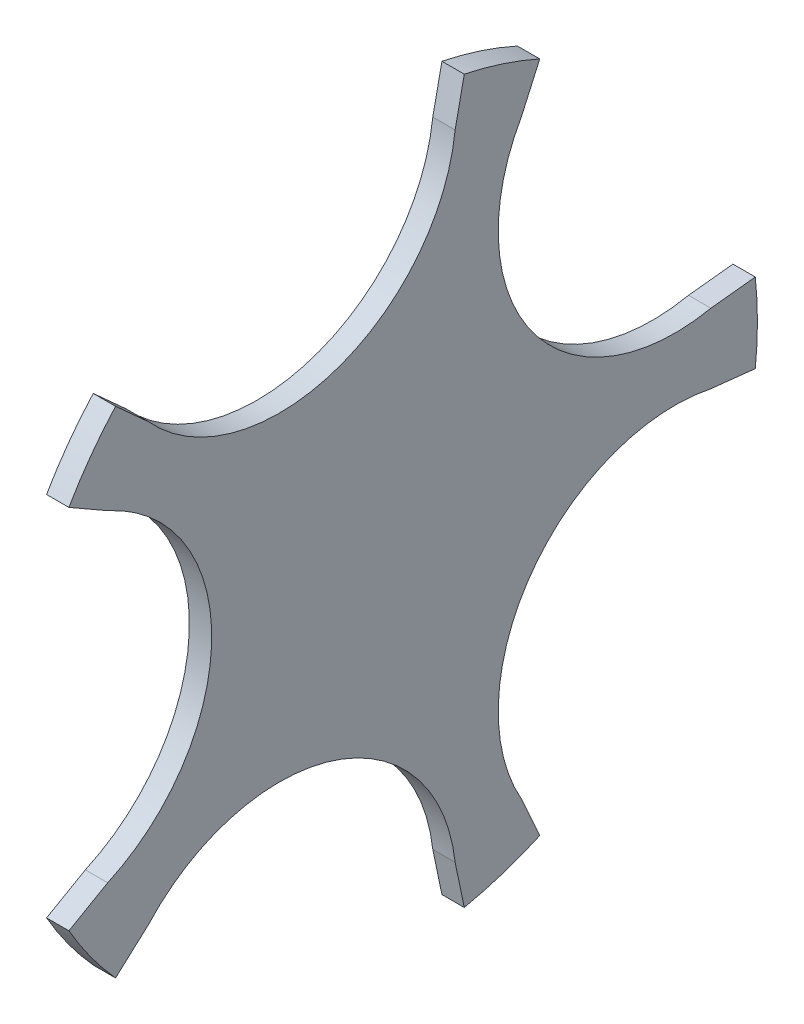
ISO-10303-21;
HEADER;
FILE_DESCRIPTION(('STEP AP214'),'2;1');
FILE_NAME('part.step','',(''),(''),'','','');
FILE_SCHEMA(('AUTOMOTIVE_DESIGN { 1 0 10303 214 1 1 1 1 }'));
ENDSEC;
DATA;
#1=APPLICATION_CONTEXT('core data for automotive mechanical design processes');
#2=APPLICATION_PROTOCOL_DEFINITION('international standard','automotive_design',2000,#1);
#3=PRODUCT_CONTEXT('',#1,'mechanical');
#4=PRODUCT('Part','Part','',(#3));
#5=PRODUCT_RELATED_PRODUCT_CATEGORY('part','',(#4));
#6=PRODUCT_DEFINITION_FORMATION('','',#4);
#7=PRODUCT_DEFINITION_CONTEXT('part definition',#1,'design');
#8=PRODUCT_DEFINITION('design','',#6,#7);
#9=PRODUCT_DEFINITION_SHAPE('','',#8);
#10=(LENGTH_UNIT() NAMED_UNIT(*) SI_UNIT(.MILLI.,.METRE.));
#11=(NAMED_UNIT(*) PLANE_ANGLE_UNIT() SI_UNIT($,.RADIAN.));
#12=(NAMED_UNIT(*) SI_UNIT($,.STERADIAN.) SOLID_ANGLE_UNIT());
#13=UNCERTAINTY_MEASURE_WITH_UNIT(LENGTH_MEASURE(1.E-05),#10,'distance_accuracy_value','');
#14=(GEOMETRIC_REPRESENTATION_CONTEXT(3) GLOBAL_UNCERTAINTY_ASSIGNED_CONTEXT((#13)) GLOBAL_UNIT_ASSIGNED_CONTEXT((#10,
#11,#12)) REPRESENTATION_CONTEXT('',''));
#15=CARTESIAN_POINT('',(0.,0.,0.));
#16=DIRECTION('',(0.,0.,1.));
#17=DIRECTION('',(1.,0.,0.));
#18=AXIS2_PLACEMENT_3D('',#15,#16,#17);
#19=CARTESIAN_POINT('',(7.1923076923077,3.32026073301961E-12,-5.08013769939808E-12));
#20=DIRECTION('',(1.,0.,0.));
#21=DIRECTION('',(0.,0.,-1.));
#22=AXIS2_PLACEMENT_3D('',#19,#20,#21);
#23=CYLINDRICAL_SURFACE('',#22,8.25000000000605);
#24=CARTESIAN_POINT('',(7.6923076923077,3.32026073301961E-12,-5.08013769939808E-12));
#25=DIRECTION('',(1.,0.,0.));
#26=DIRECTION('',(0.,0.,-1.));
#27=AXIS2_PLACEMENT_3D('',#24,#25,#26);
#28=CIRCLE('',#27,8.25000000000605);
#29=CARTESIAN_POINT('',(7.6923076923077,-4.1024089888532,7.1577049735356));
#30=VERTEX_POINT('',#29);
#31=CARTESIAN_POINT('',(7.6923076923077,-5.5396678613671,6.1134752789013));
#32=VERTEX_POINT('',#31);
#33=EDGE_CURVE('E206',#30,#32,#28,.T.);
#34=ORIENTED_EDGE('',*,*,#33,.F.);
#35=DIRECTION('',(1.,0.,0.));
#36=VECTOR('',#35,1.);
#37=CARTESIAN_POINT('',(7.1923076923077,-4.1024089888532,7.1577049735356));
#38=LINE('',#37,#36);
#39=CARTESIAN_POINT('',(7.1923076923077,-4.1024089888532,7.1577049735356));
#40=VERTEX_POINT('',#39);
#41=EDGE_CURVE('E11',#40,#30,#38,.T.);
#42=ORIENTED_EDGE('',*,*,#41,.F.);
#43=CARTESIAN_POINT('',(7.1923076923077,3.32026073301961E-12,-5.08013769939808E-12));
#44=DIRECTION('',(1.,0.,0.));
#45=DIRECTION('',(0.,0.,-1.));
#46=AXIS2_PLACEMENT_3D('',#43,#44,#45);
#47=CIRCLE('',#46,8.25000000000605);
#48=CARTESIAN_POINT('',(7.1923076923077,-5.5396678613671,6.1134752789013));
#49=VERTEX_POINT('',#48);
#50=EDGE_CURVE('E262',#40,#49,#47,.T.);
#51=ORIENTED_EDGE('',*,*,#50,.T.);
#52=DIRECTION('',(1.,0.,0.));
#53=VECTOR('',#52,1.);
#54=CARTESIAN_POINT('',(7.1923076923077,-5.5396678613671,6.1134752789013));
#55=LINE('',#54,#53);
#56=EDGE_CURVE('E40',#49,#32,#55,.T.);
#57=ORIENTED_EDGE('',*,*,#56,.T.);
#58=EDGE_LOOP('',(#34,#42,#51,#57));
#59=FACE_BOUND('',#58,.T.);
#60=ADVANCED_FACE('F37',(#59),#23,.T.);
#61=CARTESIAN_POINT('',(7.1923076923077,-3.6052767652143,6.290330267768));
#62=DIRECTION('',(0.,0.867600602852798,0.497261695618577));
#63=DIRECTION('',(0.,-0.497261695618577,0.867600602852798));
#64=AXIS2_PLACEMENT_3D('',#61,#62,#63);
#65=PLANE('',#64);
#66=DIRECTION('',(0.,-0.497261695618577,0.867600602852797));
#67=VECTOR('',#66,1.);
#68=CARTESIAN_POINT('',(7.6923076923077,-3.6052767652143,6.290330267768));
#69=LINE('',#68,#67);
#70=CARTESIAN_POINT('',(7.6923076923077,-3.6052767652143,6.290330267768));
#71=VERTEX_POINT('',#70);
#72=EDGE_CURVE('E260',#71,#30,#69,.T.);
#73=ORIENTED_EDGE('',*,*,#72,.F.);
#74=DIRECTION('',(1.,0.,0.));
#75=VECTOR('',#74,1.);
#76=CARTESIAN_POINT('',(7.1923076923077,-3.6052767652143,6.290330267768));
#77=LINE('',#76,#75);
#78=CARTESIAN_POINT('',(7.1923076923077,-3.6052767652143,6.290330267768));
#79=VERTEX_POINT('',#78);
#80=EDGE_CURVE('E46',#79,#71,#77,.T.);
#81=ORIENTED_EDGE('',*,*,#80,.F.);
#82=DIRECTION('',(0.,-0.497261695618577,0.867600602852797));
#83=VECTOR('',#82,1.);
#84=CARTESIAN_POINT('',(7.1923076923077,-3.6052767652143,6.290330267768));
#85=LINE('',#84,#83);
#86=EDGE_CURVE('E196',#79,#40,#85,.T.);
#87=ORIENTED_EDGE('',*,*,#86,.T.);
#88=ORIENTED_EDGE('',*,*,#41,.T.);
#89=EDGE_LOOP('',(#73,#81,#87,#88));
#90=FACE_BOUND('',#89,.T.);
#91=ADVANCED_FACE('F298',(#90),#65,.T.);
#92=CARTESIAN_POINT('',(7.1923076923077,0.,7.91701322744224));
#93=DIRECTION('',(1.,0.,0.));
#94=DIRECTION('',(0.,0.,-1.));
#95=AXIS2_PLACEMENT_3D('',#92,#93,#94);
#96=CYLINDRICAL_SURFACE('',#95,3.95526459356244);
#97=CARTESIAN_POINT('',(7.6923076923077,0.,7.91701322744224));
#98=DIRECTION('',(-1.,0.,0.));
#99=DIRECTION('',(0.,0.,1.));
#100=AXIS2_PLACEMENT_3D('',#97,#98,#99);
#101=CIRCLE('',#100,3.95526459356244);
#102=CARTESIAN_POINT('',(7.6923076923077,3.6052767652143,6.290330267768));
#103=VERTEX_POINT('',#102);
#104=EDGE_CURVE('E183',#103,#71,#101,.T.);
#105=ORIENTED_EDGE('',*,*,#104,.F.);
#106=DIRECTION('',(1.,0.,0.));
#107=VECTOR('',#106,1.);
#108=CARTESIAN_POINT('',(7.1923076923077,3.6052767652143,6.290330267768));
#109=LINE('',#108,#107);
#110=CARTESIAN_POINT('',(7.1923076923077,3.6052767652143,6.290330267768));
#111=VERTEX_POINT('',#110);
#112=EDGE_CURVE('E178',#111,#103,#109,.T.);
#113=ORIENTED_EDGE('',*,*,#112,.F.);
#114=CARTESIAN_POINT('',(7.1923076923077,0.,7.91701322744224));
#115=DIRECTION('',(-1.,0.,0.));
#116=DIRECTION('',(0.,0.,1.));
#117=AXIS2_PLACEMENT_3D('',#114,#115,#116);
#118=CIRCLE('',#117,3.95526459356244);
#119=EDGE_CURVE('E181',#111,#79,#118,.T.);
#120=ORIENTED_EDGE('',*,*,#119,.T.);
#121=ORIENTED_EDGE('',*,*,#80,.T.);
#122=EDGE_LOOP('',(#105,#113,#120,#121));
#123=FACE_BOUND('',#122,.T.);
#124=ADVANCED_FACE('F180',(#123),#96,.F.);
#125=CARTESIAN_POINT('',(7.1923076923077,4.1024089888532,7.1577049735356));
#126=DIRECTION('',(0.,-0.867600602852798,0.497261695618577));
#127=DIRECTION('',(0.,-0.497261695618577,-0.867600602852798));
#128=AXIS2_PLACEMENT_3D('',#125,#126,#127);
#129=PLANE('',#128);
#130=DIRECTION('',(0.,-0.497261695618577,-0.867600602852797));
#131=VECTOR('',#130,1.);
#132=CARTESIAN_POINT('',(7.6923076923077,4.1024089888532,7.1577049735356));
#133=LINE('',#132,#131);
#134=CARTESIAN_POINT('',(7.6923076923077,4.1024089888532,7.1577049735356));
#135=VERTEX_POINT('',#134);
#136=EDGE_CURVE('E257',#135,#103,#133,.T.);
#137=ORIENTED_EDGE('',*,*,#136,.F.);
#138=DIRECTION('',(1.,0.,0.));
#139=VECTOR('',#138,1.);
#140=CARTESIAN_POINT('',(7.1923076923077,4.1024089888532,7.1577049735356));
#141=LINE('',#140,#139);
#142=CARTESIAN_POINT('',(7.1923076923077,4.1024089888532,7.1577049735356));
#143=VERTEX_POINT('',#142);
#144=EDGE_CURVE('E188',#143,#135,#141,.T.);
#145=ORIENTED_EDGE('',*,*,#144,.F.);
#146=DIRECTION('',(0.,-0.497261695618577,-0.867600602852797));
#147=VECTOR('',#146,1.);
#148=CARTESIAN_POINT('',(7.1923076923077,4.1024089888532,7.1577049735356));
#149=LINE('',#148,#147);
#150=EDGE_CURVE('E194',#143,#111,#149,.T.);
#151=ORIENTED_EDGE('',*,*,#150,.T.);
#152=ORIENTED_EDGE('',*,*,#112,.T.);
#153=EDGE_LOOP('',(#137,#145,#151,#152));
#154=FACE_BOUND('',#153,.T.);
#155=ADVANCED_FACE('F198',(#154),#129,.T.);
#156=CARTESIAN_POINT('',(7.1923076923077,3.32026073301961E-12,-5.08013769939808E-12));
#157=DIRECTION('',(1.,0.,0.));
#158=DIRECTION('',(0.,0.,-1.));
#159=AXIS2_PLACEMENT_3D('',#156,#157,#158);
#160=CYLINDRICAL_SURFACE('',#159,8.25000000000213);
#161=CARTESIAN_POINT('',(7.6923076923077,3.32026073301961E-12,-5.08013769939808E-12));
#162=DIRECTION('',(1.,0.,0.));
#163=DIRECTION('',(0.,0.,-1.));
#164=AXIS2_PLACEMENT_3D('',#161,#162,#163);
#165=CIRCLE('',#164,8.25000000000213);
#166=CARTESIAN_POINT('',(7.6923076923077,5.53966786136751,6.11347527890166));
#167=VERTEX_POINT('',#166);
#168=EDGE_CURVE('E254',#167,#135,#165,.T.);
#169=ORIENTED_EDGE('',*,*,#168,.F.);
#170=DIRECTION('',(1.,0.,0.));
#171=VECTOR('',#170,1.);
#172=CARTESIAN_POINT('',(7.1923076923077,5.53966786136751,6.11347527890166));
#173=LINE('',#172,#171);
#174=CARTESIAN_POINT('',(7.1923076923077,5.53966786136751,6.11347527890166));
#175=VERTEX_POINT('',#174);
#176=EDGE_CURVE('E266',#175,#167,#173,.T.);
#177=ORIENTED_EDGE('',*,*,#176,.F.);
#178=CARTESIAN_POINT('',(7.1923076923077,3.32026073301961E-12,-5.08013769939808E-12));
#179=DIRECTION('',(1.,0.,0.));
#180=DIRECTION('',(0.,0.,-1.));
#181=AXIS2_PLACEMENT_3D('',#178,#179,#180);
#182=CIRCLE('',#181,8.25000000000213);
#183=EDGE_CURVE('E199',#175,#143,#182,.T.);
#184=ORIENTED_EDGE('',*,*,#183,.T.);
#185=ORIENTED_EDGE('',*,*,#144,.T.);
#186=EDGE_LOOP('',(#169,#177,#184,#185));
#187=FACE_BOUND('',#186,.T.);
#188=ADVANCED_FACE('F311',(#187),#160,.T.);
#189=CARTESIAN_POINT('',(7.1923076923077,4.8683678009331,5.3726409135761));
#190=DIRECTION('',(0.,0.741027306533449,-0.671474892286958));
#191=DIRECTION('',(0.,0.671474892286958,0.741027306533449));
#192=AXIS2_PLACEMENT_3D('',#189,#190,#191);
#193=PLANE('',#192);
#194=DIRECTION('',(0.,0.671474892286958,0.741027306533449));
#195=VECTOR('',#194,1.);
#196=CARTESIAN_POINT('',(7.6923076923077,4.8683678009331,5.3726409135761));
#197=LINE('',#196,#195);
#198=CARTESIAN_POINT('',(7.6923076923077,4.8683678009331,5.3726409135761));
#199=VERTEX_POINT('',#198);
#200=EDGE_CURVE('E251',#199,#167,#197,.T.);
#201=ORIENTED_EDGE('',*,*,#200,.F.);
#202=DIRECTION('',(1.,0.,0.));
#203=VECTOR('',#202,1.);
#204=CARTESIAN_POINT('',(7.1923076923077,4.8683678009331,5.3726409135761));
#205=LINE('',#204,#203);
#206=CARTESIAN_POINT('',(7.1923076923077,4.8683678009331,5.3726409135761));
#207=VERTEX_POINT('',#206);
#208=EDGE_CURVE('E268',#207,#199,#205,.T.);
#209=ORIENTED_EDGE('',*,*,#208,.F.);
#210=DIRECTION('',(0.,0.671474892286958,0.741027306533449));
#211=VECTOR('',#210,1.);
#212=CARTESIAN_POINT('',(7.1923076923077,4.8683678009331,5.3726409135761));
#213=LINE('',#212,#211);
#214=EDGE_CURVE('E201',#207,#175,#213,.T.);
#215=ORIENTED_EDGE('',*,*,#214,.T.);
#216=ORIENTED_EDGE('',*,*,#176,.T.);
#217=EDGE_LOOP('',(#201,#209,#215,#216));
#218=FACE_BOUND('',#217,.T.);
#219=ADVANCED_FACE('F314',(#218),#193,.T.);
#220=CARTESIAN_POINT('',(7.1923076923077,7.52952701955393,2.44649163197091));
#221=DIRECTION('',(1.,0.,0.));
#222=DIRECTION('',(0.,0.,-1.));
#223=AXIS2_PLACEMENT_3D('',#220,#221,#222);
#224=CYLINDRICAL_SURFACE('',#223,3.9552645935625);
#225=CARTESIAN_POINT('',(7.6923076923077,7.52952701955393,2.44649163197091));
#226=DIRECTION('',(-1.,0.,0.));
#227=DIRECTION('',(0.,0.,1.));
#228=AXIS2_PLACEMENT_3D('',#225,#226,#227);
#229=CIRCLE('',#228,3.9552645935625);
#230=CARTESIAN_POINT('',(7.6923076923077,7.0965513806858,-1.4850030076332));
#231=VERTEX_POINT('',#230);
#232=EDGE_CURVE('E248',#231,#199,#229,.T.);
#233=ORIENTED_EDGE('',*,*,#232,.F.);
#234=DIRECTION('',(1.,0.,0.));
#235=VECTOR('',#234,1.);
#236=CARTESIAN_POINT('',(7.1923076923077,7.0965513806858,-1.4850030076332));
#237=LINE('',#236,#235);
#238=CARTESIAN_POINT('',(7.1923076923077,7.0965513806858,-1.4850030076332));
#239=VERTEX_POINT('',#238);
#240=EDGE_CURVE('E270',#239,#231,#237,.T.);
#241=ORIENTED_EDGE('',*,*,#240,.F.);
#242=CARTESIAN_POINT('',(7.1923076923077,7.52952701955393,2.44649163197091));
#243=DIRECTION('',(-1.,0.,0.));
#244=DIRECTION('',(0.,0.,1.));
#245=AXIS2_PLACEMENT_3D('',#242,#243,#244);
#246=CIRCLE('',#245,3.9552645935625);
#247=EDGE_CURVE('E553',#239,#207,#246,.T.);
#248=ORIENTED_EDGE('',*,*,#247,.T.);
#249=ORIENTED_EDGE('',*,*,#208,.T.);
#250=EDGE_LOOP('',(#233,#241,#248,#249));
#251=FACE_BOUND('',#250,.T.);
#252=ADVANCED_FACE('F318',(#251),#224,.F.);
#253=CARTESIAN_POINT('',(7.1923076923077,8.0750960522315,-1.6897703238121));
#254=DIRECTION('',(0.,0.204820645310543,0.978799521482603));
#255=DIRECTION('',(0.,-0.978799521482603,0.204820645310543));
#256=AXIS2_PLACEMENT_3D('',#253,#254,#255);
#257=PLANE('',#256);
#258=DIRECTION('',(0.,-0.978799521482603,0.204820645310543));
#259=VECTOR('',#258,1.);
#260=CARTESIAN_POINT('',(7.6923076923077,8.0750960522315,-1.6897703238121));
#261=LINE('',#260,#259);
#262=CARTESIAN_POINT('',(7.6923076923077,8.0750960522315,-1.6897703238121));
#263=VERTEX_POINT('',#262);
#264=EDGE_CURVE('E245',#263,#231,#261,.T.);
#265=ORIENTED_EDGE('',*,*,#264,.F.);
#266=DIRECTION('',(1.,0.,0.));
#267=VECTOR('',#266,1.);
#268=CARTESIAN_POINT('',(7.1923076923077,8.0750960522315,-1.6897703238121));
#269=LINE('',#268,#267);
#270=CARTESIAN_POINT('',(7.1923076923077,8.0750960522315,-1.6897703238121));
#271=VERTEX_POINT('',#270);
#272=EDGE_CURVE('E272',#271,#263,#269,.T.);
#273=ORIENTED_EDGE('',*,*,#272,.F.);
#274=DIRECTION('',(0.,-0.978799521482603,0.204820645310543));
#275=VECTOR('',#274,1.);
#276=CARTESIAN_POINT('',(7.1923076923077,8.0750960522315,-1.6897703238121));
#277=LINE('',#276,#275);
#278=EDGE_CURVE('E546',#271,#239,#277,.T.);
#279=ORIENTED_EDGE('',*,*,#278,.T.);
#280=ORIENTED_EDGE('',*,*,#240,.T.);
#281=EDGE_LOOP('',(#265,#273,#279,#280));
#282=FACE_BOUND('',#281,.T.);
#283=ADVANCED_FACE('F322',(#282),#257,.T.);
#284=CARTESIAN_POINT('',(7.1923076923077,3.32026073301961E-12,-5.08013769939808E-12));
#285=DIRECTION('',(1.,0.,0.));
#286=DIRECTION('',(0.,0.,-1.));
#287=AXIS2_PLACEMENT_3D('',#284,#285,#286);
#288=CYLINDRICAL_SURFACE('',#287,8.24999999999532);
#289=CARTESIAN_POINT('',(7.6923076923077,3.32026073301961E-12,-5.08013769939808E-12));
#290=DIRECTION('',(1.,0.,0.));
#291=DIRECTION('',(0.,0.,-1.));
#292=AXIS2_PLACEMENT_3D('',#289,#290,#291);
#293=CIRCLE('',#292,8.24999999999532);
#294=CARTESIAN_POINT('',(7.6923076923077,7.5261120135639,-3.37936946179258));
#295=VERTEX_POINT('',#294);
#296=EDGE_CURVE('E242',#295,#263,#293,.T.);
#297=ORIENTED_EDGE('',*,*,#296,.F.);
#298=DIRECTION('',(1.,0.,0.));
#299=VECTOR('',#298,1.);
#300=CARTESIAN_POINT('',(7.1923076923077,7.5261120135639,-3.37936946179258));
#301=LINE('',#300,#299);
#302=CARTESIAN_POINT('',(7.1923076923077,7.5261120135639,-3.37936946179258));
#303=VERTEX_POINT('',#302);
#304=EDGE_CURVE('E274',#303,#295,#301,.T.);
#305=ORIENTED_EDGE('',*,*,#304,.F.);
#306=CARTESIAN_POINT('',(7.1923076923077,3.32026073301961E-12,-5.08013769939808E-12));
#307=DIRECTION('',(1.,0.,0.));
#308=DIRECTION('',(0.,0.,-1.));
#309=AXIS2_PLACEMENT_3D('',#306,#307,#308);
#310=CIRCLE('',#309,8.24999999999532);
#311=EDGE_CURVE('E542',#303,#271,#310,.T.);
#312=ORIENTED_EDGE('',*,*,#311,.T.);
#313=ORIENTED_EDGE('',*,*,#272,.T.);
#314=EDGE_LOOP('',(#297,#305,#312,#313));
#315=FACE_BOUND('',#314,.T.);
#316=ADVANCED_FACE('F326',(#315),#288,.T.);
#317=CARTESIAN_POINT('',(7.1923076923077,6.6140935359266,-2.9698555738298));
#318=DIRECTION('',(0.,-0.409620540823309,-0.912256001644067));
#319=DIRECTION('',(0.,0.912256001644067,-0.409620540823309));
#320=AXIS2_PLACEMENT_3D('',#317,#318,#319);
#321=PLANE('',#320);
#322=DIRECTION('',(0.,0.912256001644067,-0.409620540823309));
#323=VECTOR('',#322,1.);
#324=CARTESIAN_POINT('',(7.6923076923077,6.6140935359266,-2.9698555738298));
#325=LINE('',#324,#323);
#326=CARTESIAN_POINT('',(7.6923076923077,6.6140935359266,-2.9698555738298));
#327=VERTEX_POINT('',#326);
#328=EDGE_CURVE('E239',#327,#295,#325,.T.);
#329=ORIENTED_EDGE('',*,*,#328,.F.);
#330=DIRECTION('',(1.,0.,0.));
#331=VECTOR('',#330,1.);
#332=CARTESIAN_POINT('',(7.1923076923077,6.6140935359266,-2.9698555738298));
#333=LINE('',#332,#331);
#334=CARTESIAN_POINT('',(7.1923076923077,6.6140935359266,-2.9698555738298));
#335=VERTEX_POINT('',#334);
#336=EDGE_CURVE('E276',#335,#327,#333,.T.);
#337=ORIENTED_EDGE('',*,*,#336,.F.);
#338=DIRECTION('',(0.,0.912256001644067,-0.409620540823309));
#339=VECTOR('',#338,1.);
#340=CARTESIAN_POINT('',(7.1923076923077,6.6140935359266,-2.9698555738298));
#341=LINE('',#340,#339);
#342=EDGE_CURVE('E558',#335,#303,#341,.T.);
#343=ORIENTED_EDGE('',*,*,#342,.T.);
#344=ORIENTED_EDGE('',*,*,#304,.T.);
#345=EDGE_LOOP('',(#329,#337,#343,#344));
#346=FACE_BOUND('',#345,.T.);
#347=ADVANCED_FACE('F330',(#346),#321,.T.);
#348=CARTESIAN_POINT('',(7.1923076923077,4.653503617295,-6.40499824569205));
#349=DIRECTION('',(1.,0.,0.));
#350=DIRECTION('',(0.,0.,-1.));
#351=AXIS2_PLACEMENT_3D('',#348,#349,#350);
#352=CYLINDRICAL_SURFACE('',#351,3.95526459356246);
#353=CARTESIAN_POINT('',(7.6923076923077,4.653503617295,-6.40499824569205));
#354=DIRECTION('',(-1.,0.,0.));
#355=DIRECTION('',(0.,0.,1.));
#356=AXIS2_PLACEMENT_3D('',#353,#354,#355);
#357=CIRCLE('',#356,3.95526459356246);
#358=CARTESIAN_POINT('',(7.6923076923077,0.780633190959471,-7.2081125998811));
#359=VERTEX_POINT('',#358);
#360=EDGE_CURVE('E236',#359,#327,#357,.T.);
#361=ORIENTED_EDGE('',*,*,#360,.F.);
#362=DIRECTION('',(1.,0.,0.));
#363=VECTOR('',#362,1.);
#364=CARTESIAN_POINT('',(7.1923076923077,0.780633190959471,-7.2081125998811));
#365=LINE('',#364,#363);
#366=CARTESIAN_POINT('',(7.1923076923077,0.780633190959471,-7.2081125998811));
#367=VERTEX_POINT('',#366);
#368=EDGE_CURVE('E278',#367,#359,#365,.T.);
#369=ORIENTED_EDGE('',*,*,#368,.F.);
#370=CARTESIAN_POINT('',(7.1923076923077,4.653503617295,-6.40499824569205));
#371=DIRECTION('',(-1.,0.,0.));
#372=DIRECTION('',(0.,0.,1.));
#373=AXIS2_PLACEMENT_3D('',#370,#371,#372);
#374=CIRCLE('',#373,3.95526459356246);
#375=EDGE_CURVE('E535',#367,#335,#374,.T.);
#376=ORIENTED_EDGE('',*,*,#375,.T.);
#377=ORIENTED_EDGE('',*,*,#336,.T.);
#378=EDGE_LOOP('',(#361,#369,#376,#377));
#379=FACE_BOUND('',#378,.T.);
#380=ADVANCED_FACE('F334',(#379),#352,.F.);
#381=CARTESIAN_POINT('',(7.1923076923077,0.88827483384591,-8.2020404668324));
#382=DIRECTION('',(0.,0.994186723252412,0.107669676829797));
#383=DIRECTION('',(0.,-0.107669676829797,0.994186723252412));
#384=AXIS2_PLACEMENT_3D('',#381,#382,#383);
#385=PLANE('',#384);
#386=DIRECTION('',(0.,-0.107669676829797,0.994186723252412));
#387=VECTOR('',#386,1.);
#388=CARTESIAN_POINT('',(7.6923076923077,0.88827483384591,-8.2020404668324));
#389=LINE('',#388,#387);
#390=CARTESIAN_POINT('',(7.6923076923077,0.88827483384591,-8.2020404668324));
#391=VERTEX_POINT('',#390);
#392=EDGE_CURVE('E233',#391,#359,#389,.T.);
#393=ORIENTED_EDGE('',*,*,#392,.F.);
#394=DIRECTION('',(1.,0.,0.));
#395=VECTOR('',#394,1.);
#396=CARTESIAN_POINT('',(7.1923076923077,0.88827483384591,-8.2020404668324));
#397=LINE('',#396,#395);
#398=CARTESIAN_POINT('',(7.1923076923077,0.88827483384591,-8.2020404668324));
#399=VERTEX_POINT('',#398);
#400=EDGE_CURVE('E280',#399,#391,#397,.T.);
#401=ORIENTED_EDGE('',*,*,#400,.F.);
#402=DIRECTION('',(0.,-0.107669676829797,0.994186723252412));
#403=VECTOR('',#402,1.);
#404=CARTESIAN_POINT('',(7.1923076923077,0.88827483384591,-8.2020404668324));
#405=LINE('',#404,#403);
#406=EDGE_CURVE('E531',#399,#367,#405,.T.);
#407=ORIENTED_EDGE('',*,*,#406,.T.);
#408=ORIENTED_EDGE('',*,*,#368,.T.);
#409=EDGE_LOOP('',(#393,#401,#407,#408));
#410=FACE_BOUND('',#409,.T.);
#411=ADVANCED_FACE('F338',(#410),#385,.T.);
#412=CARTESIAN_POINT('',(7.1923076923077,3.32026073301961E-12,-5.08013769939808E-12));
#413=DIRECTION('',(1.,0.,0.));
#414=DIRECTION('',(0.,0.,-1.));
#415=AXIS2_PLACEMENT_3D('',#412,#413,#414);
#416=CYLINDRICAL_SURFACE('',#415,8.24999999999497);
#417=CARTESIAN_POINT('',(7.6923076923077,3.32026073301961E-12,-5.08013769939808E-12));
#418=DIRECTION('',(1.,0.,0.));
#419=DIRECTION('',(0.,0.,-1.));
#420=AXIS2_PLACEMENT_3D('',#417,#418,#419);
#421=CIRCLE('',#420,8.24999999999497);
#422=CARTESIAN_POINT('',(7.6923076923077,-0.88827483384588,-8.20204046683205));
#423=VERTEX_POINT('',#422);
#424=EDGE_CURVE('E230',#423,#391,#421,.T.);
#425=ORIENTED_EDGE('',*,*,#424,.F.);
#426=DIRECTION('',(1.,0.,0.));
#427=VECTOR('',#426,1.);
#428=CARTESIAN_POINT('',(7.1923076923077,-0.88827483384588,-8.20204046683205));
#429=LINE('',#428,#427);
#430=CARTESIAN_POINT('',(7.1923076923077,-0.88827483384588,-8.20204046683205));
#431=VERTEX_POINT('',#430);
#432=EDGE_CURVE('E282',#431,#423,#429,.T.);
#433=ORIENTED_EDGE('',*,*,#432,.F.);
#434=CARTESIAN_POINT('',(7.1923076923077,3.32026073301961E-12,-5.08013769939808E-12));
#435=DIRECTION('',(1.,0.,0.));
#436=DIRECTION('',(0.,0.,-1.));
#437=AXIS2_PLACEMENT_3D('',#434,#435,#436);
#438=CIRCLE('',#437,8.24999999999497);
#439=EDGE_CURVE('E562',#431,#399,#438,.T.);
#440=ORIENTED_EDGE('',*,*,#439,.T.);
#441=ORIENTED_EDGE('',*,*,#400,.T.);
#442=EDGE_LOOP('',(#425,#433,#440,#441));
#443=FACE_BOUND('',#442,.T.);
#444=ADVANCED_FACE('F342',(#443),#416,.T.);
#445=CARTESIAN_POINT('',(7.1923076923077,-0.78063319095948,-7.2081125998812));
#446=DIRECTION('',(0.,-0.99418672325241,0.107669676829808));
#447=DIRECTION('',(0.,-0.107669676829808,-0.99418672325241));
#448=AXIS2_PLACEMENT_3D('',#445,#446,#447);
#449=PLANE('',#448);
#450=DIRECTION('',(0.,-0.107669676829808,-0.99418672325241));
#451=VECTOR('',#450,1.);
#452=CARTESIAN_POINT('',(7.6923076923077,-0.78063319095948,-7.2081125998812));
#453=LINE('',#452,#451);
#454=CARTESIAN_POINT('',(7.6923076923077,-0.78063319095948,-7.2081125998812));
#455=VERTEX_POINT('',#454);
#456=EDGE_CURVE('E227',#455,#423,#453,.T.);
#457=ORIENTED_EDGE('',*,*,#456,.F.);
#458=DIRECTION('',(1.,0.,0.));
#459=VECTOR('',#458,1.);
#460=CARTESIAN_POINT('',(7.1923076923077,-0.78063319095948,-7.2081125998812));
#461=LINE('',#460,#459);
#462=CARTESIAN_POINT('',(7.1923076923077,-0.78063319095948,-7.2081125998812));
#463=VERTEX_POINT('',#462);
#464=EDGE_CURVE('E284',#463,#455,#461,.T.);
#465=ORIENTED_EDGE('',*,*,#464,.F.);
#466=DIRECTION('',(0.,-0.107669676829808,-0.99418672325241));
#467=VECTOR('',#466,1.);
#468=CARTESIAN_POINT('',(7.1923076923077,-0.78063319095948,-7.2081125998812));
#469=LINE('',#468,#467);
#470=EDGE_CURVE('E524',#463,#431,#469,.T.);
#471=ORIENTED_EDGE('',*,*,#470,.T.);
#472=ORIENTED_EDGE('',*,*,#432,.T.);
#473=EDGE_LOOP('',(#457,#465,#471,#472));
#474=FACE_BOUND('',#473,.T.);
#475=ADVANCED_FACE('F346',(#474),#449,.T.);
#476=CARTESIAN_POINT('',(7.1923076923077,-4.65350361729503,-6.40499824569207));
#477=DIRECTION('',(1.,0.,0.));
#478=DIRECTION('',(0.,0.,-1.));
#479=AXIS2_PLACEMENT_3D('',#476,#477,#478);
#480=CYLINDRICAL_SURFACE('',#479,3.9552645935625);
#481=CARTESIAN_POINT('',(7.6923076923077,-4.65350361729503,-6.40499824569207));
#482=DIRECTION('',(-1.,0.,0.));
#483=DIRECTION('',(0.,0.,1.));
#484=AXIS2_PLACEMENT_3D('',#481,#482,#483);
#485=CIRCLE('',#484,3.9552645935625);
#486=CARTESIAN_POINT('',(7.6923076923077,-6.6140935359265,-2.9698555738297));
#487=VERTEX_POINT('',#486);
#488=EDGE_CURVE('E224',#487,#455,#485,.T.);
#489=ORIENTED_EDGE('',*,*,#488,.F.);
#490=DIRECTION('',(1.,0.,0.));
#491=VECTOR('',#490,1.);
#492=CARTESIAN_POINT('',(7.1923076923077,-6.6140935359265,-2.9698555738297));
#493=LINE('',#492,#491);
#494=CARTESIAN_POINT('',(7.1923076923077,-6.6140935359265,-2.9698555738297));
#495=VERTEX_POINT('',#494);
#496=EDGE_CURVE('E286',#495,#487,#493,.T.);
#497=ORIENTED_EDGE('',*,*,#496,.F.);
#498=CARTESIAN_POINT('',(7.1923076923077,-4.65350361729503,-6.40499824569207));
#499=DIRECTION('',(-1.,0.,0.));
#500=DIRECTION('',(0.,0.,1.));
#501=AXIS2_PLACEMENT_3D('',#498,#499,#500);
#502=CIRCLE('',#501,3.9552645935625);
#503=EDGE_CURVE('E520',#495,#463,#502,.T.);
#504=ORIENTED_EDGE('',*,*,#503,.T.);
#505=ORIENTED_EDGE('',*,*,#464,.T.);
#506=EDGE_LOOP('',(#489,#497,#504,#505));
#507=FACE_BOUND('',#506,.T.);
#508=ADVANCED_FACE('F350',(#507),#480,.F.);
#509=CARTESIAN_POINT('',(7.1923076923077,-7.5261120135635,-3.3793694617924));
#510=DIRECTION('',(0.,0.409620540823355,-0.912256001644046));
#511=DIRECTION('',(0.,0.912256001644046,0.409620540823355));
#512=AXIS2_PLACEMENT_3D('',#509,#510,#511);
#513=PLANE('',#512);
#514=DIRECTION('',(0.,0.912256001644046,0.409620540823355));
#515=VECTOR('',#514,1.);
#516=CARTESIAN_POINT('',(7.6923076923077,-7.5261120135635,-3.3793694617924));
#517=LINE('',#516,#515);
#518=CARTESIAN_POINT('',(7.6923076923077,-7.5261120135635,-3.3793694617924));
#519=VERTEX_POINT('',#518);
#520=EDGE_CURVE('E221',#519,#487,#517,.T.);
#521=ORIENTED_EDGE('',*,*,#520,.F.);
#522=DIRECTION('',(1.,0.,0.));
#523=VECTOR('',#522,1.);
#524=CARTESIAN_POINT('',(7.1923076923077,-7.5261120135635,-3.3793694617924));
#525=LINE('',#524,#523);
#526=CARTESIAN_POINT('',(7.1923076923077,-7.5261120135635,-3.3793694617924));
#527=VERTEX_POINT('',#526);
#528=EDGE_CURVE('E288',#527,#519,#525,.T.);
#529=ORIENTED_EDGE('',*,*,#528,.F.);
#530=DIRECTION('',(0.,0.912256001644046,0.409620540823355));
#531=VECTOR('',#530,1.);
#532=CARTESIAN_POINT('',(7.1923076923077,-7.5261120135635,-3.3793694617924));
#533=LINE('',#532,#531);
#534=EDGE_CURVE('E566',#527,#495,#533,.T.);
#535=ORIENTED_EDGE('',*,*,#534,.T.);
#536=ORIENTED_EDGE('',*,*,#496,.T.);
#537=EDGE_LOOP('',(#521,#529,#535,#536));
#538=FACE_BOUND('',#537,.T.);
#539=ADVANCED_FACE('F354',(#538),#513,.T.);
#540=CARTESIAN_POINT('',(7.1923076923077,3.32026073301961E-12,-5.08013769939808E-12));
#541=DIRECTION('',(1.,0.,0.));
#542=DIRECTION('',(0.,0.,-1.));
#543=AXIS2_PLACEMENT_3D('',#540,#541,#542);
#544=CYLINDRICAL_SURFACE('',#543,8.2500000000016);
#545=CARTESIAN_POINT('',(7.6923076923077,3.32026073301961E-12,-5.08013769939808E-12));
#546=DIRECTION('',(1.,0.,0.));
#547=DIRECTION('',(0.,0.,-1.));
#548=AXIS2_PLACEMENT_3D('',#545,#546,#547);
#549=CIRCLE('',#548,8.2500000000016);
#550=CARTESIAN_POINT('',(7.6923076923077,-8.07509605223085,-1.68977032381196));
#551=VERTEX_POINT('',#550);
#552=EDGE_CURVE('E218',#551,#519,#549,.T.);
#553=ORIENTED_EDGE('',*,*,#552,.F.);
#554=DIRECTION('',(1.,0.,0.));
#555=VECTOR('',#554,1.);
#556=CARTESIAN_POINT('',(7.1923076923077,-8.07509605223085,-1.68977032381196));
#557=LINE('',#556,#555);
#558=CARTESIAN_POINT('',(7.1923076923077,-8.07509605223085,-1.68977032381196));
#559=VERTEX_POINT('',#558);
#560=EDGE_CURVE('E290',#559,#551,#557,.T.);
#561=ORIENTED_EDGE('',*,*,#560,.F.);
#562=CARTESIAN_POINT('',(7.1923076923077,3.32026073301961E-12,-5.08013769939808E-12));
#563=DIRECTION('',(1.,0.,0.));
#564=DIRECTION('',(0.,0.,-1.));
#565=AXIS2_PLACEMENT_3D('',#562,#563,#564);
#566=CIRCLE('',#565,8.2500000000016);
#567=EDGE_CURVE('E513',#559,#527,#566,.T.);
#568=ORIENTED_EDGE('',*,*,#567,.T.);
#569=ORIENTED_EDGE('',*,*,#528,.T.);
#570=EDGE_LOOP('',(#553,#561,#568,#569));
#571=FACE_BOUND('',#570,.T.);
#572=ADVANCED_FACE('F358',(#571),#544,.T.);
#573=CARTESIAN_POINT('',(7.1923076923077,-7.0965513806858,-1.4850030076332));
#574=DIRECTION('',(0.,-0.204820645310543,0.978799521482603));
#575=DIRECTION('',(0.,-0.978799521482603,-0.204820645310543));
#576=AXIS2_PLACEMENT_3D('',#573,#574,#575);
#577=PLANE('',#576);
#578=DIRECTION('',(0.,-0.978799521482603,-0.204820645310543));
#579=VECTOR('',#578,1.);
#580=CARTESIAN_POINT('',(7.6923076923077,-7.0965513806858,-1.4850030076332));
#581=LINE('',#580,#579);
#582=CARTESIAN_POINT('',(7.6923076923077,-7.0965513806858,-1.4850030076332));
#583=VERTEX_POINT('',#582);
#584=EDGE_CURVE('E215',#583,#551,#581,.T.);
#585=ORIENTED_EDGE('',*,*,#584,.F.);
#586=DIRECTION('',(1.,0.,0.));
#587=VECTOR('',#586,1.);
#588=CARTESIAN_POINT('',(7.1923076923077,-7.0965513806858,-1.4850030076332));
#589=LINE('',#588,#587);
#590=CARTESIAN_POINT('',(7.1923076923077,-7.0965513806858,-1.4850030076332));
#591=VERTEX_POINT('',#590);
#592=EDGE_CURVE('E292',#591,#583,#589,.T.);
#593=ORIENTED_EDGE('',*,*,#592,.F.);
#594=DIRECTION('',(0.,-0.978799521482603,-0.204820645310543));
#595=VECTOR('',#594,1.);
#596=CARTESIAN_POINT('',(7.1923076923077,-7.0965513806858,-1.4850030076332));
#597=LINE('',#596,#595);
#598=EDGE_CURVE('E509',#591,#559,#597,.T.);
#599=ORIENTED_EDGE('',*,*,#598,.T.);
#600=ORIENTED_EDGE('',*,*,#560,.T.);
#601=EDGE_LOOP('',(#585,#593,#599,#600));
#602=FACE_BOUND('',#601,.T.);
#603=ADVANCED_FACE('F362',(#602),#577,.T.);
#604=CARTESIAN_POINT('',(7.1923076923077,-7.52952701955388,2.44649163197086));
#605=DIRECTION('',(1.,0.,0.));
#606=DIRECTION('',(0.,0.,-1.));
#607=AXIS2_PLACEMENT_3D('',#604,#605,#606);
#608=CYLINDRICAL_SURFACE('',#607,3.95526459356244);
#609=CARTESIAN_POINT('',(7.6923076923077,-7.52952701955388,2.44649163197086));
#610=DIRECTION('',(-1.,0.,0.));
#611=DIRECTION('',(0.,0.,1.));
#612=AXIS2_PLACEMENT_3D('',#609,#610,#611);
#613=CIRCLE('',#612,3.95526459356244);
#614=CARTESIAN_POINT('',(7.6923076923077,-4.8683678009331,5.372640913576));
#615=VERTEX_POINT('',#614);
#616=EDGE_CURVE('E212',#615,#583,#613,.T.);
#617=ORIENTED_EDGE('',*,*,#616,.F.);
#618=DIRECTION('',(1.,0.,0.));
#619=VECTOR('',#618,1.);
#620=CARTESIAN_POINT('',(7.1923076923077,-4.8683678009331,5.372640913576));
#621=LINE('',#620,#619);
#622=CARTESIAN_POINT('',(7.1923076923077,-4.8683678009331,5.372640913576));
#623=VERTEX_POINT('',#622);
#624=EDGE_CURVE('E293',#623,#615,#621,.T.);
#625=ORIENTED_EDGE('',*,*,#624,.F.);
#626=CARTESIAN_POINT('',(7.1923076923077,-7.52952701955388,2.44649163197086));
#627=DIRECTION('',(-1.,0.,0.));
#628=DIRECTION('',(0.,0.,1.));
#629=AXIS2_PLACEMENT_3D('',#626,#627,#628);
#630=CIRCLE('',#629,3.95526459356244);
#631=EDGE_CURVE('E570',#623,#591,#630,.T.);
#632=ORIENTED_EDGE('',*,*,#631,.T.);
#633=ORIENTED_EDGE('',*,*,#592,.T.);
#634=EDGE_LOOP('',(#617,#625,#632,#633));
#635=FACE_BOUND('',#634,.T.);
#636=ADVANCED_FACE('F366',(#635),#608,.F.);
#637=CARTESIAN_POINT('',(7.1923076923077,-5.5396678613671,6.1134752789013));
#638=DIRECTION('',(0.,-0.741027306533539,-0.671474892286859));
#639=DIRECTION('',(0.,0.671474892286859,-0.741027306533539));
#640=AXIS2_PLACEMENT_3D('',#637,#638,#639);
#641=PLANE('',#640);
#642=DIRECTION('',(0.,0.671474892286859,-0.741027306533539));
#643=VECTOR('',#642,1.);
#644=CARTESIAN_POINT('',(7.6923076923077,-5.5396678613671,6.1134752789013));
#645=LINE('',#644,#643);
#646=EDGE_CURVE('E209',#32,#615,#645,.T.);
#647=ORIENTED_EDGE('',*,*,#646,.F.);
#648=ORIENTED_EDGE('',*,*,#56,.F.);
#649=DIRECTION('',(0.,0.671474892286859,-0.741027306533539));
#650=VECTOR('',#649,1.);
#651=CARTESIAN_POINT('',(7.1923076923077,-5.5396678613671,6.1134752789013));
#652=LINE('',#651,#650);
#653=EDGE_CURVE('E572',#49,#623,#652,.T.);
#654=ORIENTED_EDGE('',*,*,#653,.T.);
#655=ORIENTED_EDGE('',*,*,#624,.T.);
#656=EDGE_LOOP('',(#647,#648,#654,#655));
#657=FACE_BOUND('',#656,.T.);
#658=ADVANCED_FACE('F295',(#657),#641,.T.);
#659=CARTESIAN_POINT('',(7.1923076923077,3.32026073301961E-12,-5.08013769939808E-12));
#660=DIRECTION('',(1.,0.,0.));
#661=DIRECTION('',(0.,0.,-1.));
#662=AXIS2_PLACEMENT_3D('',#659,#660,#661);
#663=PLANE('',#662);
#664=ORIENTED_EDGE('',*,*,#50,.F.);
#665=ORIENTED_EDGE('',*,*,#86,.F.);
#666=ORIENTED_EDGE('',*,*,#119,.F.);
#667=ORIENTED_EDGE('',*,*,#150,.F.);
#668=ORIENTED_EDGE('',*,*,#183,.F.);
#669=ORIENTED_EDGE('',*,*,#214,.F.);
#670=ORIENTED_EDGE('',*,*,#247,.F.);
#671=ORIENTED_EDGE('',*,*,#278,.F.);
#672=ORIENTED_EDGE('',*,*,#311,.F.);
#673=ORIENTED_EDGE('',*,*,#342,.F.);
#674=ORIENTED_EDGE('',*,*,#375,.F.);
#675=ORIENTED_EDGE('',*,*,#406,.F.);
#676=ORIENTED_EDGE('',*,*,#439,.F.);
#677=ORIENTED_EDGE('',*,*,#470,.F.);
#678=ORIENTED_EDGE('',*,*,#503,.F.);
#679=ORIENTED_EDGE('',*,*,#534,.F.);
#680=ORIENTED_EDGE('',*,*,#567,.F.);
#681=ORIENTED_EDGE('',*,*,#598,.F.);
#682=ORIENTED_EDGE('',*,*,#631,.F.);
#683=ORIENTED_EDGE('',*,*,#653,.F.);
#684=EDGE_LOOP('',(#664,#665,#666,#667,#668,#669,#670,#671,#672,#673,#674,#675,#676,#677,#678,
#679,#680,#681,#682,#683));
#685=FACE_BOUND('',#684,.T.);
#686=ADVANCED_FACE('F192',(#685),#663,.F.);
#687=CARTESIAN_POINT('',(7.6923076923077,3.32026073301961E-12,-5.08013769939808E-12));
#688=DIRECTION('',(1.,0.,0.));
#689=DIRECTION('',(0.,0.,-1.));
#690=AXIS2_PLACEMENT_3D('',#687,#688,#689);
#691=PLANE('',#690);
#692=ORIENTED_EDGE('',*,*,#33,.T.);
#693=ORIENTED_EDGE('',*,*,#646,.T.);
#694=ORIENTED_EDGE('',*,*,#616,.T.);
#695=ORIENTED_EDGE('',*,*,#584,.T.);
#696=ORIENTED_EDGE('',*,*,#552,.T.);
#697=ORIENTED_EDGE('',*,*,#520,.T.);
#698=ORIENTED_EDGE('',*,*,#488,.T.);
#699=ORIENTED_EDGE('',*,*,#456,.T.);
#700=ORIENTED_EDGE('',*,*,#424,.T.);
#701=ORIENTED_EDGE('',*,*,#392,.T.);
#702=ORIENTED_EDGE('',*,*,#360,.T.);
#703=ORIENTED_EDGE('',*,*,#328,.T.);
#704=ORIENTED_EDGE('',*,*,#296,.T.);
#705=ORIENTED_EDGE('',*,*,#264,.T.);
#706=ORIENTED_EDGE('',*,*,#232,.T.);
#707=ORIENTED_EDGE('',*,*,#200,.T.);
#708=ORIENTED_EDGE('',*,*,#168,.T.);
#709=ORIENTED_EDGE('',*,*,#136,.T.);
#710=ORIENTED_EDGE('',*,*,#104,.T.);
#711=ORIENTED_EDGE('',*,*,#72,.T.);
#712=EDGE_LOOP('',(#692,#693,#694,#695,#696,#697,#698,#699,#700,#701,#702,#703,#704,#705,#706,
#707,#708,#709,#710,#711));
#713=FACE_BOUND('',#712,.T.);
#714=ADVANCED_FACE('F297',(#713),#691,.T.);
#715=CLOSED_SHELL('',(#60,#91,#124,#155,#188,#219,#252,#283,#316,#347,#380,#411,#444,#475,#508,
#539,#572,#603,#636,#658,#686,#714));
#716=MANIFOLD_SOLID_BREP('B2',#715);
#717=ADVANCED_BREP_SHAPE_REPRESENTATION('',(#18,#716),#14);
#718=SHAPE_DEFINITION_REPRESENTATION(#9,#717);
ENDSEC;
END-ISO-10303-21;
